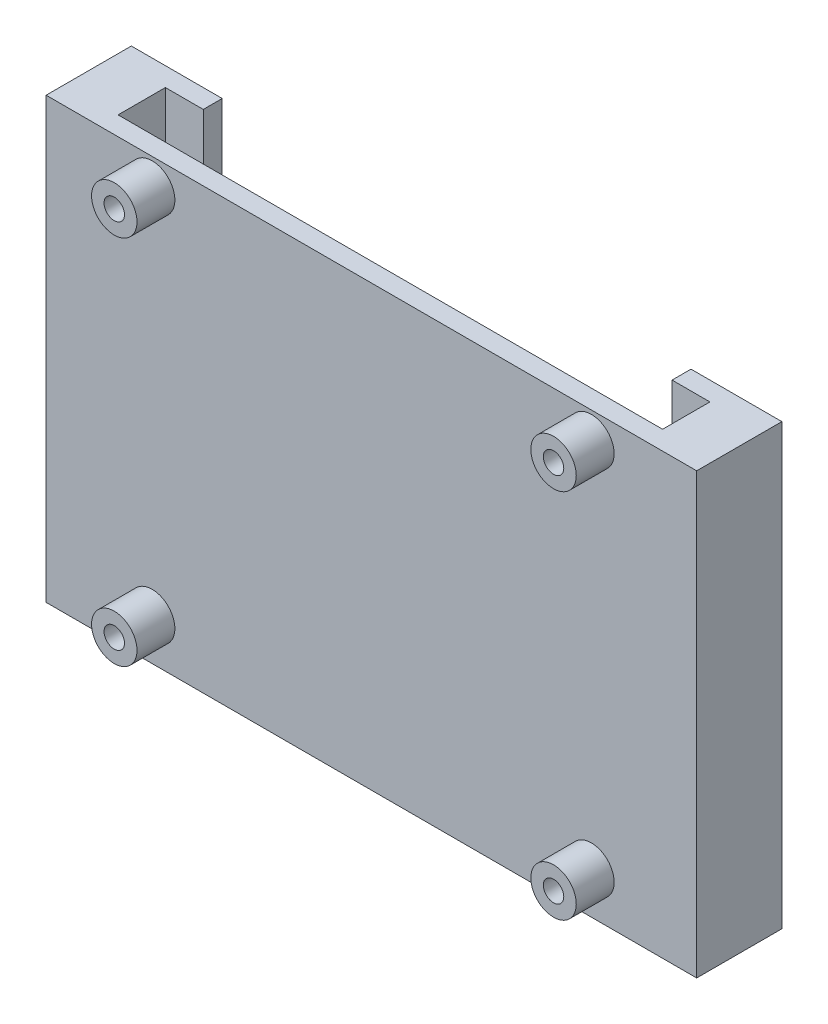
ISO-10303-21;
HEADER;
FILE_DESCRIPTION(('STEP AP214'),'2;1');
FILE_NAME('part.step','',(''),(''),'','','');
FILE_SCHEMA(('AUTOMOTIVE_DESIGN { 1 0 10303 214 1 1 1 1 }'));
ENDSEC;
DATA;
#1=APPLICATION_CONTEXT('core data for automotive mechanical design processes');
#2=APPLICATION_PROTOCOL_DEFINITION('international standard','automotive_design',2000,#1);
#3=PRODUCT_CONTEXT('',#1,'mechanical');
#4=PRODUCT('Part','Part','',(#3));
#5=PRODUCT_RELATED_PRODUCT_CATEGORY('part','',(#4));
#6=PRODUCT_DEFINITION_FORMATION('','',#4);
#7=PRODUCT_DEFINITION_CONTEXT('part definition',#1,'design');
#8=PRODUCT_DEFINITION('design','',#6,#7);
#9=PRODUCT_DEFINITION_SHAPE('','',#8);
#10=(LENGTH_UNIT() NAMED_UNIT(*) SI_UNIT(.MILLI.,.METRE.));
#11=(NAMED_UNIT(*) PLANE_ANGLE_UNIT() SI_UNIT($,.RADIAN.));
#12=(NAMED_UNIT(*) SI_UNIT($,.STERADIAN.) SOLID_ANGLE_UNIT());
#13=UNCERTAINTY_MEASURE_WITH_UNIT(LENGTH_MEASURE(1.E-05),#10,'distance_accuracy_value','');
#14=(GEOMETRIC_REPRESENTATION_CONTEXT(3) GLOBAL_UNCERTAINTY_ASSIGNED_CONTEXT((#13)) GLOBAL_UNIT_ASSIGNED_CONTEXT((#10,
#11,#12)) REPRESENTATION_CONTEXT('',''));
#15=CARTESIAN_POINT('',(0.,0.,0.));
#16=DIRECTION('',(0.,0.,1.));
#17=DIRECTION('',(1.,0.,0.));
#18=AXIS2_PLACEMENT_3D('',#15,#16,#17);
#19=CARTESIAN_POINT('',(-35.95,29.,-8.75));
#20=DIRECTION('',(-1.,0.,0.));
#21=DIRECTION('',(0.,-1.,0.));
#22=AXIS2_PLACEMENT_3D('',#19,#20,#21);
#23=PLANE('',#22);
#24=DIRECTION('',(0.,-1.,0.));
#25=VECTOR('',#24,1.);
#26=CARTESIAN_POINT('',(-35.95,29.,-6.24999999999999));
#27=LINE('',#26,#25);
#28=CARTESIAN_POINT('',(-35.95,29.,-6.24999999999999));
#29=VERTEX_POINT('',#28);
#30=CARTESIAN_POINT('',(-35.95,-29.,-6.24999999999999));
#31=VERTEX_POINT('',#30);
#32=EDGE_CURVE('E167',#29,#31,#27,.T.);
#33=ORIENTED_EDGE('',*,*,#32,.F.);
#34=DIRECTION('',(0.,0.,1.));
#35=VECTOR('',#34,1.);
#36=CARTESIAN_POINT('',(-35.95,29.,-8.75));
#37=LINE('',#36,#35);
#38=CARTESIAN_POINT('',(-35.95,29.,0.));
#39=VERTEX_POINT('',#38);
#40=EDGE_CURVE('E209',#29,#39,#37,.T.);
#41=ORIENTED_EDGE('',*,*,#40,.T.);
#42=DIRECTION('',(0.,-1.,0.));
#43=VECTOR('',#42,1.);
#44=CARTESIAN_POINT('',(-35.95,29.,0.));
#45=LINE('',#44,#43);
#46=CARTESIAN_POINT('',(-35.95,-29.,0.));
#47=VERTEX_POINT('',#46);
#48=EDGE_CURVE('E214',#39,#47,#45,.T.);
#49=ORIENTED_EDGE('',*,*,#48,.T.);
#50=DIRECTION('',(0.,0.,1.));
#51=VECTOR('',#50,1.);
#52=CARTESIAN_POINT('',(-35.95,-29.,-8.75));
#53=LINE('',#52,#51);
#54=EDGE_CURVE('E61',#31,#47,#53,.T.);
#55=ORIENTED_EDGE('',*,*,#54,.F.);
#56=EDGE_LOOP('',(#33,#41,#49,#55));
#57=FACE_BOUND('',#56,.T.);
#58=ADVANCED_FACE('F45',(#57),#23,.F.);
#59=CARTESIAN_POINT('',(35.95,29.,-8.75));
#60=DIRECTION('',(1.,0.,0.));
#61=DIRECTION('',(0.,1.,0.));
#62=AXIS2_PLACEMENT_3D('',#59,#60,#61);
#63=PLANE('',#62);
#64=DIRECTION('',(0.,1.,0.));
#65=VECTOR('',#64,1.);
#66=CARTESIAN_POINT('',(35.95,29.,-6.25));
#67=LINE('',#66,#65);
#68=CARTESIAN_POINT('',(35.95,-29.,-6.24999999999999));
#69=VERTEX_POINT('',#68);
#70=CARTESIAN_POINT('',(35.95,29.,-6.25));
#71=VERTEX_POINT('',#70);
#72=EDGE_CURVE('E185',#69,#71,#67,.T.);
#73=ORIENTED_EDGE('',*,*,#72,.F.);
#74=DIRECTION('',(0.,0.,1.));
#75=VECTOR('',#74,1.);
#76=CARTESIAN_POINT('',(35.95,-29.,-8.75));
#77=LINE('',#76,#75);
#78=CARTESIAN_POINT('',(35.95,-29.,0.));
#79=VERTEX_POINT('',#78);
#80=EDGE_CURVE('E69',#69,#79,#77,.T.);
#81=ORIENTED_EDGE('',*,*,#80,.T.);
#82=DIRECTION('',(0.,1.,0.));
#83=VECTOR('',#82,1.);
#84=CARTESIAN_POINT('',(35.95,29.,0.));
#85=LINE('',#84,#83);
#86=CARTESIAN_POINT('',(35.95,29.,0.));
#87=VERTEX_POINT('',#86);
#88=EDGE_CURVE('E217',#79,#87,#85,.T.);
#89=ORIENTED_EDGE('',*,*,#88,.T.);
#90=DIRECTION('',(0.,0.,1.));
#91=VECTOR('',#90,1.);
#92=CARTESIAN_POINT('',(35.95,29.,-8.75));
#93=LINE('',#92,#91);
#94=EDGE_CURVE('E233',#71,#87,#93,.T.);
#95=ORIENTED_EDGE('',*,*,#94,.F.);
#96=EDGE_LOOP('',(#73,#81,#89,#95));
#97=FACE_BOUND('',#96,.T.);
#98=ADVANCED_FACE('F364',(#97),#63,.F.);
#99=CARTESIAN_POINT('',(0.,0.,0.));
#100=DIRECTION('',(0.,0.,-1.));
#101=DIRECTION('',(-1.,0.,0.));
#102=AXIS2_PLACEMENT_3D('',#99,#100,#101);
#103=PLANE('',#102);
#104=CARTESIAN_POINT('',(-28.95,25.5,0.));
#105=DIRECTION('',(0.,0.,1.));
#106=DIRECTION('',(1.,0.,0.));
#107=AXIS2_PLACEMENT_3D('',#104,#105,#106);
#108=CIRCLE('',#107,1.35);
#109=CARTESIAN_POINT('',(-27.6,25.5,0.));
#110=VERTEX_POINT('',#109);
#111=EDGE_CURVE('E244',#110,#110,#108,.T.);
#112=ORIENTED_EDGE('',*,*,#111,.T.);
#113=EDGE_LOOP('',(#112));
#114=FACE_BOUND('',#113,.T.);
#115=CARTESIAN_POINT('',(-28.95,-23.5,0.));
#116=DIRECTION('',(0.,0.,1.));
#117=DIRECTION('',(1.,0.,0.));
#118=AXIS2_PLACEMENT_3D('',#115,#116,#117);
#119=CIRCLE('',#118,1.35);
#120=CARTESIAN_POINT('',(-27.6,-23.5,0.));
#121=VERTEX_POINT('',#120);
#122=EDGE_CURVE('E252',#121,#121,#119,.T.);
#123=ORIENTED_EDGE('',*,*,#122,.T.);
#124=EDGE_LOOP('',(#123));
#125=FACE_BOUND('',#124,.T.);
#126=CARTESIAN_POINT('',(29.05,25.5,0.));
#127=DIRECTION('',(0.,0.,1.));
#128=DIRECTION('',(1.,0.,0.));
#129=AXIS2_PLACEMENT_3D('',#126,#127,#128);
#130=CIRCLE('',#129,1.35);
#131=CARTESIAN_POINT('',(30.4,25.5,0.));
#132=VERTEX_POINT('',#131);
#133=EDGE_CURVE('E260',#132,#132,#130,.T.);
#134=ORIENTED_EDGE('',*,*,#133,.T.);
#135=EDGE_LOOP('',(#134));
#136=FACE_BOUND('',#135,.T.);
#137=CARTESIAN_POINT('',(29.05,-23.5,0.));
#138=DIRECTION('',(0.,0.,1.));
#139=DIRECTION('',(1.,0.,0.));
#140=AXIS2_PLACEMENT_3D('',#137,#138,#139);
#141=CIRCLE('',#140,1.35);
#142=CARTESIAN_POINT('',(30.4,-23.5,0.));
#143=VERTEX_POINT('',#142);
#144=EDGE_CURVE('E268',#143,#143,#141,.T.);
#145=ORIENTED_EDGE('',*,*,#144,.T.);
#146=EDGE_LOOP('',(#145));
#147=FACE_BOUND('',#146,.T.);
#148=DIRECTION('',(1.,0.,0.));
#149=VECTOR('',#148,1.);
#150=CARTESIAN_POINT('',(-42.95,-29.,0.));
#151=LINE('',#150,#149);
#152=EDGE_CURVE('E294',#47,#79,#151,.T.);
#153=ORIENTED_EDGE('',*,*,#152,.F.);
#154=ORIENTED_EDGE('',*,*,#48,.F.);
#155=DIRECTION('',(-1.,0.,0.));
#156=VECTOR('',#155,1.);
#157=CARTESIAN_POINT('',(-42.95,29.,0.));
#158=LINE('',#157,#156);
#159=EDGE_CURVE('E288',#87,#39,#158,.T.);
#160=ORIENTED_EDGE('',*,*,#159,.F.);
#161=ORIENTED_EDGE('',*,*,#88,.F.);
#162=EDGE_LOOP('',(#153,#154,#160,#161));
#163=FACE_BOUND('',#162,.T.);
#164=ADVANCED_FACE('F368',(#114,#125,#136,#147,#163),#103,.T.);
#165=CARTESIAN_POINT('',(42.95,-29.,2.5));
#166=DIRECTION('',(-1.,0.,0.));
#167=DIRECTION('',(0.,0.,1.));
#168=AXIS2_PLACEMENT_3D('',#165,#166,#167);
#169=PLANE('',#168);
#170=DIRECTION('',(0.,0.,-1.));
#171=VECTOR('',#170,1.);
#172=CARTESIAN_POINT('',(42.95,-29.,2.5));
#173=LINE('',#172,#171);
#174=CARTESIAN_POINT('',(42.95,-29.,2.5));
#175=VERTEX_POINT('',#174);
#176=CARTESIAN_POINT('',(42.95,-29.,-8.75));
#177=VERTEX_POINT('',#176);
#178=EDGE_CURVE('E303',#175,#177,#173,.T.);
#179=ORIENTED_EDGE('',*,*,#178,.T.);
#180=DIRECTION('',(0.,-1.,0.));
#181=VECTOR('',#180,1.);
#182=CARTESIAN_POINT('',(42.95,29.,-8.75));
#183=LINE('',#182,#181);
#184=CARTESIAN_POINT('',(42.95,29.,-8.75));
#185=VERTEX_POINT('',#184);
#186=EDGE_CURVE('E222',#185,#177,#183,.T.);
#187=ORIENTED_EDGE('',*,*,#186,.F.);
#188=DIRECTION('',(0.,0.,-1.));
#189=VECTOR('',#188,1.);
#190=CARTESIAN_POINT('',(42.95,29.,2.5));
#191=LINE('',#190,#189);
#192=CARTESIAN_POINT('',(42.95,29.,2.5));
#193=VERTEX_POINT('',#192);
#194=EDGE_CURVE('E317',#193,#185,#191,.T.);
#195=ORIENTED_EDGE('',*,*,#194,.F.);
#196=DIRECTION('',(0.,1.,0.));
#197=VECTOR('',#196,1.);
#198=CARTESIAN_POINT('',(42.95,-29.,2.5));
#199=LINE('',#198,#197);
#200=EDGE_CURVE('E289',#175,#193,#199,.T.);
#201=ORIENTED_EDGE('',*,*,#200,.F.);
#202=EDGE_LOOP('',(#179,#187,#195,#201));
#203=FACE_BOUND('',#202,.T.);
#204=ADVANCED_FACE('F47',(#203),#169,.F.);
#205=CARTESIAN_POINT('',(-42.95,29.,2.5));
#206=DIRECTION('',(0.,-1.,0.));
#207=DIRECTION('',(0.,0.,-1.));
#208=AXIS2_PLACEMENT_3D('',#205,#206,#207);
#209=PLANE('',#208);
#210=ORIENTED_EDGE('',*,*,#194,.T.);
#211=DIRECTION('',(1.,0.,0.));
#212=VECTOR('',#211,1.);
#213=CARTESIAN_POINT('',(42.95,29.,-8.75));
#214=LINE('',#213,#212);
#215=CARTESIAN_POINT('',(30.95,29.,-8.75));
#216=VERTEX_POINT('',#215);
#217=EDGE_CURVE('E229',#216,#185,#214,.T.);
#218=ORIENTED_EDGE('',*,*,#217,.F.);
#219=DIRECTION('',(0.,0.,-1.));
#220=VECTOR('',#219,1.);
#221=CARTESIAN_POINT('',(30.95,29.,-8.75));
#222=LINE('',#221,#220);
#223=CARTESIAN_POINT('',(30.95,29.,-6.25));
#224=VERTEX_POINT('',#223);
#225=EDGE_CURVE('E196',#224,#216,#222,.T.);
#226=ORIENTED_EDGE('',*,*,#225,.F.);
#227=DIRECTION('',(1.,0.,0.));
#228=VECTOR('',#227,1.);
#229=CARTESIAN_POINT('',(30.95,29.,-6.25));
#230=LINE('',#229,#228);
#231=EDGE_CURVE('E200',#224,#71,#230,.T.);
#232=ORIENTED_EDGE('',*,*,#231,.T.);
#233=ORIENTED_EDGE('',*,*,#94,.T.);
#234=ORIENTED_EDGE('',*,*,#159,.T.);
#235=ORIENTED_EDGE('',*,*,#40,.F.);
#236=DIRECTION('',(-1.,0.,0.));
#237=VECTOR('',#236,1.);
#238=CARTESIAN_POINT('',(-30.95,29.,-6.24999999999999));
#239=LINE('',#238,#237);
#240=CARTESIAN_POINT('',(-30.95,29.,-6.24999999999999));
#241=VERTEX_POINT('',#240);
#242=EDGE_CURVE('E156',#241,#29,#239,.T.);
#243=ORIENTED_EDGE('',*,*,#242,.F.);
#244=DIRECTION('',(0.,0.,1.));
#245=VECTOR('',#244,1.);
#246=CARTESIAN_POINT('',(-30.95,29.,-8.75));
#247=LINE('',#246,#245);
#248=CARTESIAN_POINT('',(-30.95,29.,-8.75));
#249=VERTEX_POINT('',#248);
#250=EDGE_CURVE('E153',#249,#241,#247,.T.);
#251=ORIENTED_EDGE('',*,*,#250,.F.);
#252=DIRECTION('',(1.,0.,0.));
#253=VECTOR('',#252,1.);
#254=CARTESIAN_POINT('',(-42.95,29.,-8.75));
#255=LINE('',#254,#253);
#256=CARTESIAN_POINT('',(-42.95,29.,-8.75));
#257=VERTEX_POINT('',#256);
#258=EDGE_CURVE('E139',#257,#249,#255,.T.);
#259=ORIENTED_EDGE('',*,*,#258,.F.);
#260=DIRECTION('',(0.,0.,-1.));
#261=VECTOR('',#260,1.);
#262=CARTESIAN_POINT('',(-42.95,29.,2.5));
#263=LINE('',#262,#261);
#264=CARTESIAN_POINT('',(-42.95,29.,2.5));
#265=VERTEX_POINT('',#264);
#266=EDGE_CURVE('E314',#265,#257,#263,.T.);
#267=ORIENTED_EDGE('',*,*,#266,.F.);
#268=DIRECTION('',(-1.,0.,0.));
#269=VECTOR('',#268,1.);
#270=CARTESIAN_POINT('',(-42.95,29.,2.5));
#271=LINE('',#270,#269);
#272=EDGE_CURVE('E293',#193,#265,#271,.T.);
#273=ORIENTED_EDGE('',*,*,#272,.F.);
#274=EDGE_LOOP('',(#210,#218,#226,#232,#233,#234,#235,#243,#251,#259,#267,#273));
#275=FACE_BOUND('',#274,.T.);
#276=ADVANCED_FACE('F154',(#275),#209,.F.);
#277=CARTESIAN_POINT('',(-42.95,-29.,2.5));
#278=DIRECTION('',(1.,0.,0.));
#279=DIRECTION('',(0.,0.,-1.));
#280=AXIS2_PLACEMENT_3D('',#277,#278,#279);
#281=PLANE('',#280);
#282=ORIENTED_EDGE('',*,*,#266,.T.);
#283=DIRECTION('',(0.,1.,0.));
#284=VECTOR('',#283,1.);
#285=CARTESIAN_POINT('',(-42.95,29.,-8.75));
#286=LINE('',#285,#284);
#287=CARTESIAN_POINT('',(-42.95,-29.,-8.75));
#288=VERTEX_POINT('',#287);
#289=EDGE_CURVE('E146',#288,#257,#286,.T.);
#290=ORIENTED_EDGE('',*,*,#289,.F.);
#291=DIRECTION('',(0.,0.,-1.));
#292=VECTOR('',#291,1.);
#293=CARTESIAN_POINT('',(-42.95,-29.,2.5));
#294=LINE('',#293,#292);
#295=CARTESIAN_POINT('',(-42.95,-29.,2.5));
#296=VERTEX_POINT('',#295);
#297=EDGE_CURVE('E311',#296,#288,#294,.T.);
#298=ORIENTED_EDGE('',*,*,#297,.F.);
#299=DIRECTION('',(0.,-1.,0.));
#300=VECTOR('',#299,1.);
#301=CARTESIAN_POINT('',(-42.95,-29.,2.5));
#302=LINE('',#301,#300);
#303=EDGE_CURVE('E297',#265,#296,#302,.T.);
#304=ORIENTED_EDGE('',*,*,#303,.F.);
#305=EDGE_LOOP('',(#282,#290,#298,#304));
#306=FACE_BOUND('',#305,.T.);
#307=ADVANCED_FACE('F377',(#306),#281,.F.);
#308=CARTESIAN_POINT('',(-42.95,-29.,2.5));
#309=DIRECTION('',(0.,1.,0.));
#310=DIRECTION('',(0.,0.,1.));
#311=AXIS2_PLACEMENT_3D('',#308,#309,#310);
#312=PLANE('',#311);
#313=CARTESIAN_POINT('',(-39.45,-29.,-3.125));
#314=DIRECTION('',(0.,-1.,0.));
#315=DIRECTION('',(0.,0.,-1.));
#316=AXIS2_PLACEMENT_3D('',#313,#314,#315);
#317=CIRCLE('',#316,3.15);
#318=CARTESIAN_POINT('',(-39.45,-29.,-6.275));
#319=VERTEX_POINT('',#318);
#320=EDGE_CURVE('E576',#319,#319,#317,.T.);
#321=ORIENTED_EDGE('',*,*,#320,.F.);
#322=EDGE_LOOP('',(#321));
#323=FACE_BOUND('',#322,.T.);
#324=CARTESIAN_POINT('',(39.45,-29.,-3.125));
#325=DIRECTION('',(0.,-1.,0.));
#326=DIRECTION('',(0.,0.,-1.));
#327=AXIS2_PLACEMENT_3D('',#324,#325,#326);
#328=CIRCLE('',#327,3.15);
#329=CARTESIAN_POINT('',(39.45,-29.,-6.275));
#330=VERTEX_POINT('',#329);
#331=EDGE_CURVE('E580',#330,#330,#328,.T.);
#332=ORIENTED_EDGE('',*,*,#331,.F.);
#333=EDGE_LOOP('',(#332));
#334=FACE_BOUND('',#333,.T.);
#335=ORIENTED_EDGE('',*,*,#297,.T.);
#336=DIRECTION('',(-1.,0.,0.));
#337=VECTOR('',#336,1.);
#338=CARTESIAN_POINT('',(-42.95,-29.,-8.75));
#339=LINE('',#338,#337);
#340=CARTESIAN_POINT('',(-30.95,-29.,-8.75000000000001));
#341=VERTEX_POINT('',#340);
#342=EDGE_CURVE('E150',#341,#288,#339,.T.);
#343=ORIENTED_EDGE('',*,*,#342,.F.);
#344=DIRECTION('',(0.,0.,-1.));
#345=VECTOR('',#344,1.);
#346=CARTESIAN_POINT('',(-30.95,-29.,-8.75000000000001));
#347=LINE('',#346,#345);
#348=CARTESIAN_POINT('',(-30.95,-29.,-6.24999999999999));
#349=VERTEX_POINT('',#348);
#350=EDGE_CURVE('E165',#349,#341,#347,.T.);
#351=ORIENTED_EDGE('',*,*,#350,.F.);
#352=DIRECTION('',(-1.,0.,0.));
#353=VECTOR('',#352,1.);
#354=CARTESIAN_POINT('',(-30.95,-29.,-6.24999999999999));
#355=LINE('',#354,#353);
#356=EDGE_CURVE('E179',#349,#31,#355,.T.);
#357=ORIENTED_EDGE('',*,*,#356,.T.);
#358=ORIENTED_EDGE('',*,*,#54,.T.);
#359=ORIENTED_EDGE('',*,*,#152,.T.);
#360=ORIENTED_EDGE('',*,*,#80,.F.);
#361=DIRECTION('',(1.,0.,0.));
#362=VECTOR('',#361,1.);
#363=CARTESIAN_POINT('',(30.95,-29.,-6.24999999999999));
#364=LINE('',#363,#362);
#365=CARTESIAN_POINT('',(30.95,-29.,-6.24999999999999));
#366=VERTEX_POINT('',#365);
#367=EDGE_CURVE('E206',#366,#69,#364,.T.);
#368=ORIENTED_EDGE('',*,*,#367,.F.);
#369=DIRECTION('',(0.,0.,1.));
#370=VECTOR('',#369,1.);
#371=CARTESIAN_POINT('',(30.95,-29.,-8.74999999999999));
#372=LINE('',#371,#370);
#373=CARTESIAN_POINT('',(30.95,-29.,-8.74999999999999));
#374=VERTEX_POINT('',#373);
#375=EDGE_CURVE('E190',#374,#366,#372,.T.);
#376=ORIENTED_EDGE('',*,*,#375,.F.);
#377=DIRECTION('',(-1.,0.,0.));
#378=VECTOR('',#377,1.);
#379=CARTESIAN_POINT('',(42.95,-29.,-8.75));
#380=LINE('',#379,#378);
#381=EDGE_CURVE('E226',#177,#374,#380,.T.);
#382=ORIENTED_EDGE('',*,*,#381,.F.);
#383=ORIENTED_EDGE('',*,*,#178,.F.);
#384=DIRECTION('',(1.,0.,0.));
#385=VECTOR('',#384,1.);
#386=CARTESIAN_POINT('',(-42.95,-29.,2.5));
#387=LINE('',#386,#385);
#388=EDGE_CURVE('E300',#296,#175,#387,.T.);
#389=ORIENTED_EDGE('',*,*,#388,.F.);
#390=EDGE_LOOP('',(#335,#343,#351,#357,#358,#359,#360,#368,#376,#382,#383,#389));
#391=FACE_BOUND('',#390,.T.);
#392=ADVANCED_FACE('F337',(#323,#334,#391),#312,.F.);
#393=CARTESIAN_POINT('',(0.,0.,2.5));
#394=DIRECTION('',(0.,0.,-1.));
#395=DIRECTION('',(-1.,0.,0.));
#396=AXIS2_PLACEMENT_3D('',#393,#394,#395);
#397=PLANE('',#396);
#398=CARTESIAN_POINT('',(29.05,-23.5,2.5));
#399=DIRECTION('',(0.,0.,-1.));
#400=DIRECTION('',(-1.,0.,0.));
#401=AXIS2_PLACEMENT_3D('',#398,#399,#400);
#402=CIRCLE('',#401,3.);
#403=CARTESIAN_POINT('',(26.05,-23.5,2.5));
#404=VERTEX_POINT('',#403);
#405=EDGE_CURVE('E11',#404,#404,#402,.F.);
#406=ORIENTED_EDGE('',*,*,#405,.F.);
#407=EDGE_LOOP('',(#406));
#408=FACE_BOUND('',#407,.T.);
#409=CARTESIAN_POINT('',(-28.95,-23.5,2.5));
#410=DIRECTION('',(0.,0.,-1.));
#411=DIRECTION('',(-1.,0.,0.));
#412=AXIS2_PLACEMENT_3D('',#409,#410,#411);
#413=CIRCLE('',#412,3.);
#414=CARTESIAN_POINT('',(-31.95,-23.5,2.5));
#415=VERTEX_POINT('',#414);
#416=EDGE_CURVE('E54',#415,#415,#413,.F.);
#417=ORIENTED_EDGE('',*,*,#416,.F.);
#418=EDGE_LOOP('',(#417));
#419=FACE_BOUND('',#418,.T.);
#420=CARTESIAN_POINT('',(29.05,25.5,2.5));
#421=DIRECTION('',(0.,0.,-1.));
#422=DIRECTION('',(-1.,0.,0.));
#423=AXIS2_PLACEMENT_3D('',#420,#421,#422);
#424=CIRCLE('',#423,3.);
#425=CARTESIAN_POINT('',(26.05,25.5,2.5));
#426=VERTEX_POINT('',#425);
#427=EDGE_CURVE('E324',#426,#426,#424,.F.);
#428=ORIENTED_EDGE('',*,*,#427,.F.);
#429=EDGE_LOOP('',(#428));
#430=FACE_BOUND('',#429,.T.);
#431=CARTESIAN_POINT('',(-28.95,25.5,2.5));
#432=DIRECTION('',(0.,0.,-1.));
#433=DIRECTION('',(-1.,0.,0.));
#434=AXIS2_PLACEMENT_3D('',#431,#432,#433);
#435=CIRCLE('',#434,3.);
#436=CARTESIAN_POINT('',(-31.95,25.5,2.5));
#437=VERTEX_POINT('',#436);
#438=EDGE_CURVE('E320',#437,#437,#435,.F.);
#439=ORIENTED_EDGE('',*,*,#438,.F.);
#440=EDGE_LOOP('',(#439));
#441=FACE_BOUND('',#440,.T.);
#442=ORIENTED_EDGE('',*,*,#200,.T.);
#443=ORIENTED_EDGE('',*,*,#272,.T.);
#444=ORIENTED_EDGE('',*,*,#303,.T.);
#445=ORIENTED_EDGE('',*,*,#388,.T.);
#446=EDGE_LOOP('',(#442,#443,#444,#445));
#447=FACE_BOUND('',#446,.T.);
#448=ADVANCED_FACE('F333',(#408,#419,#430,#441,#447),#397,.F.);
#449=CARTESIAN_POINT('',(-28.95,25.5,7.5));
#450=DIRECTION('',(0.,0.,-1.));
#451=DIRECTION('',(-1.,0.,0.));
#452=AXIS2_PLACEMENT_3D('',#449,#450,#451);
#453=CYLINDRICAL_SURFACE('',#452,3.);
#454=CARTESIAN_POINT('',(-28.95,25.5,7.5));
#455=DIRECTION('',(0.,0.,1.));
#456=DIRECTION('',(1.,0.,0.));
#457=AXIS2_PLACEMENT_3D('',#454,#455,#456);
#458=CIRCLE('',#457,3.);
#459=CARTESIAN_POINT('',(-25.95,25.5,7.5));
#460=VERTEX_POINT('',#459);
#461=EDGE_CURVE('E284',#460,#460,#458,.T.);
#462=ORIENTED_EDGE('',*,*,#461,.F.);
#463=EDGE_LOOP('',(#462));
#464=FACE_BOUND('',#463,.T.);
#465=ORIENTED_EDGE('',*,*,#438,.T.);
#466=EDGE_LOOP('',(#465));
#467=FACE_BOUND('',#466,.T.);
#468=ADVANCED_FACE('F336',(#464,#467),#453,.T.);
#469=CARTESIAN_POINT('',(-28.95,25.5,7.5));
#470=DIRECTION('',(0.,0.,1.));
#471=DIRECTION('',(1.,0.,0.));
#472=AXIS2_PLACEMENT_3D('',#469,#470,#471);
#473=PLANE('',#472);
#474=CARTESIAN_POINT('',(-28.95,25.5,7.5));
#475=DIRECTION('',(0.,0.,1.));
#476=DIRECTION('',(1.,0.,0.));
#477=AXIS2_PLACEMENT_3D('',#474,#475,#476);
#478=CIRCLE('',#477,1.34999999999999);
#479=CARTESIAN_POINT('',(-27.6,25.5,7.5));
#480=VERTEX_POINT('',#479);
#481=EDGE_CURVE('E240',#480,#480,#478,.T.);
#482=ORIENTED_EDGE('',*,*,#481,.F.);
#483=EDGE_LOOP('',(#482));
#484=FACE_BOUND('',#483,.T.);
#485=ORIENTED_EDGE('',*,*,#461,.T.);
#486=EDGE_LOOP('',(#485));
#487=FACE_BOUND('',#486,.T.);
#488=ADVANCED_FACE('F433',(#484,#487),#473,.T.);
#489=CARTESIAN_POINT('',(29.05,25.5,7.5));
#490=DIRECTION('',(0.,0.,-1.));
#491=DIRECTION('',(-1.,0.,0.));
#492=AXIS2_PLACEMENT_3D('',#489,#490,#491);
#493=CYLINDRICAL_SURFACE('',#492,3.);
#494=CARTESIAN_POINT('',(29.05,25.5,7.5));
#495=DIRECTION('',(0.,0.,1.));
#496=DIRECTION('',(1.,0.,0.));
#497=AXIS2_PLACEMENT_3D('',#494,#495,#496);
#498=CIRCLE('',#497,3.);
#499=CARTESIAN_POINT('',(32.05,25.5,7.5));
#500=VERTEX_POINT('',#499);
#501=EDGE_CURVE('E280',#500,#500,#498,.T.);
#502=ORIENTED_EDGE('',*,*,#501,.F.);
#503=EDGE_LOOP('',(#502));
#504=FACE_BOUND('',#503,.T.);
#505=ORIENTED_EDGE('',*,*,#427,.T.);
#506=EDGE_LOOP('',(#505));
#507=FACE_BOUND('',#506,.T.);
#508=ADVANCED_FACE('F430',(#504,#507),#493,.T.);
#509=CARTESIAN_POINT('',(29.05,25.5,7.5));
#510=DIRECTION('',(0.,0.,1.));
#511=DIRECTION('',(1.,0.,0.));
#512=AXIS2_PLACEMENT_3D('',#509,#510,#511);
#513=PLANE('',#512);
#514=CARTESIAN_POINT('',(29.05,25.5,7.5));
#515=DIRECTION('',(0.,0.,1.));
#516=DIRECTION('',(1.,0.,0.));
#517=AXIS2_PLACEMENT_3D('',#514,#515,#516);
#518=CIRCLE('',#517,1.34999999999999);
#519=CARTESIAN_POINT('',(30.4,25.5,7.5));
#520=VERTEX_POINT('',#519);
#521=EDGE_CURVE('E256',#520,#520,#518,.T.);
#522=ORIENTED_EDGE('',*,*,#521,.F.);
#523=EDGE_LOOP('',(#522));
#524=FACE_BOUND('',#523,.T.);
#525=ORIENTED_EDGE('',*,*,#501,.T.);
#526=EDGE_LOOP('',(#525));
#527=FACE_BOUND('',#526,.T.);
#528=ADVANCED_FACE('F428',(#524,#527),#513,.T.);
#529=CARTESIAN_POINT('',(-28.95,-23.5,7.5));
#530=DIRECTION('',(0.,0.,-1.));
#531=DIRECTION('',(-1.,0.,0.));
#532=AXIS2_PLACEMENT_3D('',#529,#530,#531);
#533=CYLINDRICAL_SURFACE('',#532,3.);
#534=CARTESIAN_POINT('',(-28.95,-23.5,7.5));
#535=DIRECTION('',(0.,0.,1.));
#536=DIRECTION('',(1.,0.,0.));
#537=AXIS2_PLACEMENT_3D('',#534,#535,#536);
#538=CIRCLE('',#537,3.);
#539=CARTESIAN_POINT('',(-25.95,-23.5,7.5));
#540=VERTEX_POINT('',#539);
#541=EDGE_CURVE('E276',#540,#540,#538,.T.);
#542=ORIENTED_EDGE('',*,*,#541,.F.);
#543=EDGE_LOOP('',(#542));
#544=FACE_BOUND('',#543,.T.);
#545=ORIENTED_EDGE('',*,*,#416,.T.);
#546=EDGE_LOOP('',(#545));
#547=FACE_BOUND('',#546,.T.);
#548=ADVANCED_FACE('F331',(#544,#547),#533,.T.);
#549=CARTESIAN_POINT('',(-28.95,-23.5,7.5));
#550=DIRECTION('',(0.,0.,1.));
#551=DIRECTION('',(1.,0.,0.));
#552=AXIS2_PLACEMENT_3D('',#549,#550,#551);
#553=PLANE('',#552);
#554=CARTESIAN_POINT('',(-28.95,-23.5,7.5));
#555=DIRECTION('',(0.,0.,1.));
#556=DIRECTION('',(1.,0.,0.));
#557=AXIS2_PLACEMENT_3D('',#554,#555,#556);
#558=CIRCLE('',#557,1.34999999999999);
#559=CARTESIAN_POINT('',(-27.6,-23.5,7.5));
#560=VERTEX_POINT('',#559);
#561=EDGE_CURVE('E248',#560,#560,#558,.T.);
#562=ORIENTED_EDGE('',*,*,#561,.F.);
#563=EDGE_LOOP('',(#562));
#564=FACE_BOUND('',#563,.T.);
#565=ORIENTED_EDGE('',*,*,#541,.T.);
#566=EDGE_LOOP('',(#565));
#567=FACE_BOUND('',#566,.T.);
#568=ADVANCED_FACE('F421',(#564,#567),#553,.T.);
#569=CARTESIAN_POINT('',(29.05,-23.5,7.5));
#570=DIRECTION('',(0.,0.,-1.));
#571=DIRECTION('',(-1.,0.,0.));
#572=AXIS2_PLACEMENT_3D('',#569,#570,#571);
#573=CYLINDRICAL_SURFACE('',#572,3.);
#574=CARTESIAN_POINT('',(29.05,-23.5,7.5));
#575=DIRECTION('',(0.,0.,1.));
#576=DIRECTION('',(1.,0.,0.));
#577=AXIS2_PLACEMENT_3D('',#574,#575,#576);
#578=CIRCLE('',#577,3.);
#579=CARTESIAN_POINT('',(32.05,-23.5,7.5));
#580=VERTEX_POINT('',#579);
#581=EDGE_CURVE('E272',#580,#580,#578,.T.);
#582=ORIENTED_EDGE('',*,*,#581,.F.);
#583=EDGE_LOOP('',(#582));
#584=FACE_BOUND('',#583,.T.);
#585=ORIENTED_EDGE('',*,*,#405,.T.);
#586=EDGE_LOOP('',(#585));
#587=FACE_BOUND('',#586,.T.);
#588=ADVANCED_FACE('F417',(#584,#587),#573,.T.);
#589=CARTESIAN_POINT('',(29.05,-23.5,7.5));
#590=DIRECTION('',(0.,0.,1.));
#591=DIRECTION('',(1.,0.,0.));
#592=AXIS2_PLACEMENT_3D('',#589,#590,#591);
#593=PLANE('',#592);
#594=CARTESIAN_POINT('',(29.05,-23.5,7.5));
#595=DIRECTION('',(0.,0.,1.));
#596=DIRECTION('',(1.,0.,0.));
#597=AXIS2_PLACEMENT_3D('',#594,#595,#596);
#598=CIRCLE('',#597,1.34999999999999);
#599=CARTESIAN_POINT('',(30.4,-23.5,7.5));
#600=VERTEX_POINT('',#599);
#601=EDGE_CURVE('E264',#600,#600,#598,.T.);
#602=ORIENTED_EDGE('',*,*,#601,.F.);
#603=EDGE_LOOP('',(#602));
#604=FACE_BOUND('',#603,.T.);
#605=ORIENTED_EDGE('',*,*,#581,.T.);
#606=EDGE_LOOP('',(#605));
#607=FACE_BOUND('',#606,.T.);
#608=ADVANCED_FACE('F413',(#604,#607),#593,.T.);
#609=CARTESIAN_POINT('',(29.05,-23.5,7.5));
#610=DIRECTION('',(0.,0.,1.));
#611=DIRECTION('',(1.,0.,0.));
#612=AXIS2_PLACEMENT_3D('',#609,#610,#611);
#613=CYLINDRICAL_SURFACE('',#612,1.35);
#614=ORIENTED_EDGE('',*,*,#144,.F.);
#615=EDGE_LOOP('',(#614));
#616=FACE_BOUND('',#615,.T.);
#617=ORIENTED_EDGE('',*,*,#601,.T.);
#618=EDGE_LOOP('',(#617));
#619=FACE_BOUND('',#618,.T.);
#620=ADVANCED_FACE('F409',(#616,#619),#613,.F.);
#621=CARTESIAN_POINT('',(29.05,25.5,7.5));
#622=DIRECTION('',(0.,0.,1.));
#623=DIRECTION('',(1.,0.,0.));
#624=AXIS2_PLACEMENT_3D('',#621,#622,#623);
#625=CYLINDRICAL_SURFACE('',#624,1.35);
#626=ORIENTED_EDGE('',*,*,#133,.F.);
#627=EDGE_LOOP('',(#626));
#628=FACE_BOUND('',#627,.T.);
#629=ORIENTED_EDGE('',*,*,#521,.T.);
#630=EDGE_LOOP('',(#629));
#631=FACE_BOUND('',#630,.T.);
#632=ADVANCED_FACE('F405',(#628,#631),#625,.F.);
#633=CARTESIAN_POINT('',(-28.95,-23.5,7.5));
#634=DIRECTION('',(0.,0.,1.));
#635=DIRECTION('',(1.,0.,0.));
#636=AXIS2_PLACEMENT_3D('',#633,#634,#635);
#637=CYLINDRICAL_SURFACE('',#636,1.35);
#638=ORIENTED_EDGE('',*,*,#122,.F.);
#639=EDGE_LOOP('',(#638));
#640=FACE_BOUND('',#639,.T.);
#641=ORIENTED_EDGE('',*,*,#561,.T.);
#642=EDGE_LOOP('',(#641));
#643=FACE_BOUND('',#642,.T.);
#644=ADVANCED_FACE('F401',(#640,#643),#637,.F.);
#645=CARTESIAN_POINT('',(-28.95,25.5,7.5));
#646=DIRECTION('',(0.,0.,1.));
#647=DIRECTION('',(1.,0.,0.));
#648=AXIS2_PLACEMENT_3D('',#645,#646,#647);
#649=CYLINDRICAL_SURFACE('',#648,1.35);
#650=ORIENTED_EDGE('',*,*,#111,.F.);
#651=EDGE_LOOP('',(#650));
#652=FACE_BOUND('',#651,.T.);
#653=ORIENTED_EDGE('',*,*,#481,.T.);
#654=EDGE_LOOP('',(#653));
#655=FACE_BOUND('',#654,.T.);
#656=ADVANCED_FACE('F397',(#652,#655),#649,.F.);
#657=CARTESIAN_POINT('',(0.,0.,-8.75));
#658=DIRECTION('',(0.,0.,-1.));
#659=DIRECTION('',(-1.,0.,0.));
#660=AXIS2_PLACEMENT_3D('',#657,#658,#659);
#661=PLANE('',#660);
#662=ORIENTED_EDGE('',*,*,#186,.T.);
#663=ORIENTED_EDGE('',*,*,#381,.T.);
#664=DIRECTION('',(0.,-1.,0.));
#665=VECTOR('',#664,1.);
#666=CARTESIAN_POINT('',(30.95,29.,-8.75));
#667=LINE('',#666,#665);
#668=EDGE_CURVE('E186',#216,#374,#667,.T.);
#669=ORIENTED_EDGE('',*,*,#668,.F.);
#670=ORIENTED_EDGE('',*,*,#217,.T.);
#671=EDGE_LOOP('',(#662,#663,#669,#670));
#672=FACE_BOUND('',#671,.T.);
#673=ADVANCED_FACE('F353',(#672),#661,.T.);
#674=CARTESIAN_POINT('',(0.,0.,-8.75));
#675=DIRECTION('',(0.,0.,1.));
#676=DIRECTION('',(1.,0.,0.));
#677=AXIS2_PLACEMENT_3D('',#674,#675,#676);
#678=PLANE('',#677);
#679=ORIENTED_EDGE('',*,*,#289,.T.);
#680=ORIENTED_EDGE('',*,*,#258,.T.);
#681=DIRECTION('',(0.,1.,0.));
#682=VECTOR('',#681,1.);
#683=CARTESIAN_POINT('',(-30.95,29.,-8.75));
#684=LINE('',#683,#682);
#685=EDGE_CURVE('E144',#341,#249,#684,.T.);
#686=ORIENTED_EDGE('',*,*,#685,.F.);
#687=ORIENTED_EDGE('',*,*,#342,.T.);
#688=EDGE_LOOP('',(#679,#680,#686,#687));
#689=FACE_BOUND('',#688,.T.);
#690=ADVANCED_FACE('F141',(#689),#678,.F.);
#691=CARTESIAN_POINT('',(30.95,29.,-6.25));
#692=DIRECTION('',(0.,0.,-1.));
#693=DIRECTION('',(0.,1.,0.));
#694=AXIS2_PLACEMENT_3D('',#691,#692,#693);
#695=PLANE('',#694);
#696=ORIENTED_EDGE('',*,*,#72,.T.);
#697=ORIENTED_EDGE('',*,*,#231,.F.);
#698=DIRECTION('',(0.,1.,0.));
#699=VECTOR('',#698,1.);
#700=CARTESIAN_POINT('',(30.95,29.,-6.25));
#701=LINE('',#700,#699);
#702=EDGE_CURVE('E193',#366,#224,#701,.T.);
#703=ORIENTED_EDGE('',*,*,#702,.F.);
#704=ORIENTED_EDGE('',*,*,#367,.T.);
#705=EDGE_LOOP('',(#696,#697,#703,#704));
#706=FACE_BOUND('',#705,.T.);
#707=ADVANCED_FACE('F379',(#706),#695,.F.);
#708=CARTESIAN_POINT('',(30.95,0.,0.));
#709=DIRECTION('',(-1.,0.,0.));
#710=DIRECTION('',(0.,-1.,0.));
#711=AXIS2_PLACEMENT_3D('',#708,#709,#710);
#712=PLANE('',#711);
#713=ORIENTED_EDGE('',*,*,#668,.T.);
#714=ORIENTED_EDGE('',*,*,#375,.T.);
#715=ORIENTED_EDGE('',*,*,#702,.T.);
#716=ORIENTED_EDGE('',*,*,#225,.T.);
#717=EDGE_LOOP('',(#713,#714,#715,#716));
#718=FACE_BOUND('',#717,.T.);
#719=ADVANCED_FACE('F357',(#718),#712,.T.);
#720=CARTESIAN_POINT('',(-30.95,29.,-6.24999999999999));
#721=DIRECTION('',(0.,0.,-1.));
#722=DIRECTION('',(0.,1.,0.));
#723=AXIS2_PLACEMENT_3D('',#720,#721,#722);
#724=PLANE('',#723);
#725=ORIENTED_EDGE('',*,*,#32,.T.);
#726=ORIENTED_EDGE('',*,*,#356,.F.);
#727=DIRECTION('',(0.,-1.,0.));
#728=VECTOR('',#727,1.);
#729=CARTESIAN_POINT('',(-30.95,29.,-6.24999999999999));
#730=LINE('',#729,#728);
#731=EDGE_CURVE('E160',#241,#349,#730,.T.);
#732=ORIENTED_EDGE('',*,*,#731,.F.);
#733=ORIENTED_EDGE('',*,*,#242,.T.);
#734=EDGE_LOOP('',(#725,#726,#732,#733));
#735=FACE_BOUND('',#734,.T.);
#736=ADVANCED_FACE('F374',(#735),#724,.F.);
#737=CARTESIAN_POINT('',(-30.95,0.,0.));
#738=DIRECTION('',(-1.,0.,0.));
#739=DIRECTION('',(0.,-1.,0.));
#740=AXIS2_PLACEMENT_3D('',#737,#738,#739);
#741=PLANE('',#740);
#742=ORIENTED_EDGE('',*,*,#685,.T.);
#743=ORIENTED_EDGE('',*,*,#250,.T.);
#744=ORIENTED_EDGE('',*,*,#731,.T.);
#745=ORIENTED_EDGE('',*,*,#350,.T.);
#746=EDGE_LOOP('',(#742,#743,#744,#745));
#747=FACE_BOUND('',#746,.T.);
#748=ADVANCED_FACE('F163',(#747),#741,.F.);
#749=CARTESIAN_POINT('',(39.45,-26.3,-3.125));
#750=DIRECTION('',(0.,-1.,0.));
#751=DIRECTION('',(0.,0.,-1.));
#752=AXIS2_PLACEMENT_3D('',#749,#750,#751);
#753=CYLINDRICAL_SURFACE('',#752,3.15);
#754=CARTESIAN_POINT('',(39.45,-26.3,-3.125));
#755=DIRECTION('',(0.,-1.,0.));
#756=DIRECTION('',(0.,0.,-1.));
#757=AXIS2_PLACEMENT_3D('',#754,#755,#756);
#758=CIRCLE('',#757,3.15);
#759=CARTESIAN_POINT('',(39.45,-26.3,-6.275));
#760=VERTEX_POINT('',#759);
#761=EDGE_CURVE('E173',#760,#760,#758,.T.);
#762=CARTESIAN_POINT('',(39.45,-26.3,-6.275));
#763=CARTESIAN_POINT('',(39.45,-26.328125,-6.275));
#764=CARTESIAN_POINT('',(39.45,-26.35625,-6.275));
#765=CARTESIAN_POINT('',(39.45,-26.4125,-6.275));
#766=CARTESIAN_POINT('',(39.45,-26.440625,-6.275));
#767=CARTESIAN_POINT('',(39.45,-26.496875,-6.275));
#768=CARTESIAN_POINT('',(39.45,-26.525,-6.275));
#769=CARTESIAN_POINT('',(39.45,-26.58125,-6.275));
#770=CARTESIAN_POINT('',(39.45,-26.609375,-6.275));
#771=CARTESIAN_POINT('',(39.45,-26.665625,-6.275));
#772=CARTESIAN_POINT('',(39.45,-26.69375,-6.275));
#773=CARTESIAN_POINT('',(39.45,-26.75,-6.275));
#774=CARTESIAN_POINT('',(39.45,-26.778125,-6.275));
#775=CARTESIAN_POINT('',(39.45,-26.834375,-6.275));
#776=CARTESIAN_POINT('',(39.45,-26.8625,-6.275));
#777=CARTESIAN_POINT('',(39.45,-26.91875,-6.275));
#778=CARTESIAN_POINT('',(39.45,-26.946875,-6.275));
#779=CARTESIAN_POINT('',(39.45,-27.003125,-6.275));
#780=CARTESIAN_POINT('',(39.45,-27.03125,-6.275));
#781=CARTESIAN_POINT('',(39.45,-27.0875,-6.275));
#782=CARTESIAN_POINT('',(39.45,-27.115625,-6.275));
#783=CARTESIAN_POINT('',(39.45,-27.171875,-6.275));
#784=CARTESIAN_POINT('',(39.45,-27.2,-6.275));
#785=CARTESIAN_POINT('',(39.45,-27.25625,-6.275));
#786=CARTESIAN_POINT('',(39.45,-27.284375,-6.275));
#787=CARTESIAN_POINT('',(39.45,-27.340625,-6.275));
#788=CARTESIAN_POINT('',(39.45,-27.36875,-6.275));
#789=CARTESIAN_POINT('',(39.45,-27.425,-6.275));
#790=CARTESIAN_POINT('',(39.45,-27.453125,-6.275));
#791=CARTESIAN_POINT('',(39.45,-27.509375,-6.275));
#792=CARTESIAN_POINT('',(39.45,-27.5375,-6.275));
#793=CARTESIAN_POINT('',(39.45,-27.59375,-6.275));
#794=CARTESIAN_POINT('',(39.45,-27.621875,-6.275));
#795=CARTESIAN_POINT('',(39.45,-27.678125,-6.275));
#796=CARTESIAN_POINT('',(39.45,-27.70625,-6.275));
#797=CARTESIAN_POINT('',(39.45,-27.7625,-6.275));
#798=CARTESIAN_POINT('',(39.45,-27.790625,-6.275));
#799=CARTESIAN_POINT('',(39.45,-27.846875,-6.275));
#800=CARTESIAN_POINT('',(39.45,-27.875,-6.275));
#801=CARTESIAN_POINT('',(39.45,-27.93125,-6.275));
#802=CARTESIAN_POINT('',(39.45,-27.959375,-6.275));
#803=CARTESIAN_POINT('',(39.45,-28.015625,-6.275));
#804=CARTESIAN_POINT('',(39.45,-28.04375,-6.275));
#805=CARTESIAN_POINT('',(39.45,-28.1,-6.275));
#806=CARTESIAN_POINT('',(39.45,-28.128125,-6.275));
#807=CARTESIAN_POINT('',(39.45,-28.184375,-6.275));
#808=CARTESIAN_POINT('',(39.45,-28.2125,-6.275));
#809=CARTESIAN_POINT('',(39.45,-28.26875,-6.275));
#810=CARTESIAN_POINT('',(39.45,-28.296875,-6.275));
#811=CARTESIAN_POINT('',(39.45,-28.353125,-6.275));
#812=CARTESIAN_POINT('',(39.45,-28.38125,-6.275));
#813=CARTESIAN_POINT('',(39.45,-28.4375,-6.275));
#814=CARTESIAN_POINT('',(39.45,-28.465625,-6.275));
#815=CARTESIAN_POINT('',(39.45,-28.521875,-6.275));
#816=CARTESIAN_POINT('',(39.45,-28.55,-6.275));
#817=CARTESIAN_POINT('',(39.45,-28.60625,-6.275));
#818=CARTESIAN_POINT('',(39.45,-28.634375,-6.275));
#819=CARTESIAN_POINT('',(39.45,-28.690625,-6.275));
#820=CARTESIAN_POINT('',(39.45,-28.71875,-6.275));
#821=CARTESIAN_POINT('',(39.45,-28.775,-6.275));
#822=CARTESIAN_POINT('',(39.45,-28.803125,-6.275));
#823=CARTESIAN_POINT('',(39.45,-28.859375,-6.275));
#824=CARTESIAN_POINT('',(39.45,-28.8875,-6.275));
#825=CARTESIAN_POINT('',(39.45,-28.94375,-6.275));
#826=CARTESIAN_POINT('',(39.45,-28.971875,-6.275));
#827=CARTESIAN_POINT('',(39.45,-29.,-6.275));
#828=B_SPLINE_CURVE_WITH_KNOTS('',3,(#762,#763,#764,#765,#766,#767,#768,#769,#770,#771,#772,
#773,#774,#775,#776,#777,#778,#779,#780,#781,#782,#783,#784,#785,#786,#787,#788,#789,#790,#791,
#792,#793,#794,#795,#796,#797,#798,#799,#800,#801,#802,#803,#804,#805,#806,#807,#808,#809,#810,
#811,#812,#813,#814,#815,#816,#817,#818,#819,#820,#821,#822,#823,#824,#825,#826,#827),
.UNSPECIFIED.,.F.,.F.,(4,2,2,2,2,2,2,2,2,2,2,2,2,2,2,2,2,2,2,2,2,2,2,2,2,2,2,2,2,2,2,2,4),(0.,
0.0843749999999976,0.168749999999999,0.253125,0.337499999999998,0.421874999999999,0.50625,
0.590624999999997,0.674999999999998,0.759375,0.843749999999997,0.928124999999998,1.0125,
1.096875,1.18125,1.265625,1.35,1.434375,1.51875,1.603125,1.6875,1.771875,1.85625,1.940625,2.025,
2.109375,2.19375,2.278125,2.3625,2.446875,2.53125,2.615625,2.7),.UNSPECIFIED.);
#829=EDGE_CURVE('BSEAM532',#760,#330,#828,.T.);
#830=ORIENTED_EDGE('',*,*,#761,.F.);
#831=ORIENTED_EDGE('',*,*,#331,.T.);
#832=ORIENTED_EDGE('',*,*,#829,.T.);
#833=ORIENTED_EDGE('',*,*,#829,.F.);
#834=EDGE_LOOP('',(#830,#832,#831,#833));
#835=FACE_BOUND('',#834,.T.);
#836=ADVANCED_FACE('F532',(#835),#753,.F.);
#837=CARTESIAN_POINT('',(39.45,-26.3,-3.125));
#838=DIRECTION('',(0.,-1.,0.));
#839=DIRECTION('',(0.,0.,-1.));
#840=AXIS2_PLACEMENT_3D('',#837,#838,#839);
#841=PLANE('',#840);
#842=ORIENTED_EDGE('',*,*,#761,.T.);
#843=EDGE_LOOP('',(#842));
#844=FACE_BOUND('',#843,.T.);
#845=ADVANCED_FACE('F540',(#844),#841,.T.);
#846=CARTESIAN_POINT('',(-39.45,-26.3,-3.125));
#847=DIRECTION('',(0.,-1.,0.));
#848=DIRECTION('',(0.,0.,-1.));
#849=AXIS2_PLACEMENT_3D('',#846,#847,#848);
#850=CYLINDRICAL_SURFACE('',#849,3.15);
#851=CARTESIAN_POINT('',(-39.45,-26.3,-3.125));
#852=DIRECTION('',(0.,-1.,0.));
#853=DIRECTION('',(0.,0.,-1.));
#854=AXIS2_PLACEMENT_3D('',#851,#852,#853);
#855=CIRCLE('',#854,3.15);
#856=CARTESIAN_POINT('',(-39.45,-26.3,-6.275));
#857=VERTEX_POINT('',#856);
#858=EDGE_CURVE('E170',#857,#857,#855,.T.);
#859=CARTESIAN_POINT('',(-39.45,-26.3,-6.275));
#860=CARTESIAN_POINT('',(-39.45,-26.328125,-6.275));
#861=CARTESIAN_POINT('',(-39.45,-26.35625,-6.275));
#862=CARTESIAN_POINT('',(-39.45,-26.4125,-6.275));
#863=CARTESIAN_POINT('',(-39.45,-26.440625,-6.275));
#864=CARTESIAN_POINT('',(-39.45,-26.496875,-6.275));
#865=CARTESIAN_POINT('',(-39.45,-26.525,-6.275));
#866=CARTESIAN_POINT('',(-39.45,-26.58125,-6.275));
#867=CARTESIAN_POINT('',(-39.45,-26.609375,-6.275));
#868=CARTESIAN_POINT('',(-39.45,-26.665625,-6.275));
#869=CARTESIAN_POINT('',(-39.45,-26.69375,-6.275));
#870=CARTESIAN_POINT('',(-39.45,-26.75,-6.275));
#871=CARTESIAN_POINT('',(-39.45,-26.778125,-6.275));
#872=CARTESIAN_POINT('',(-39.45,-26.834375,-6.275));
#873=CARTESIAN_POINT('',(-39.45,-26.8625,-6.275));
#874=CARTESIAN_POINT('',(-39.45,-26.91875,-6.275));
#875=CARTESIAN_POINT('',(-39.45,-26.946875,-6.275));
#876=CARTESIAN_POINT('',(-39.45,-27.003125,-6.275));
#877=CARTESIAN_POINT('',(-39.45,-27.03125,-6.275));
#878=CARTESIAN_POINT('',(-39.45,-27.0875,-6.275));
#879=CARTESIAN_POINT('',(-39.45,-27.115625,-6.275));
#880=CARTESIAN_POINT('',(-39.45,-27.171875,-6.275));
#881=CARTESIAN_POINT('',(-39.45,-27.2,-6.275));
#882=CARTESIAN_POINT('',(-39.45,-27.25625,-6.275));
#883=CARTESIAN_POINT('',(-39.45,-27.284375,-6.275));
#884=CARTESIAN_POINT('',(-39.45,-27.340625,-6.275));
#885=CARTESIAN_POINT('',(-39.45,-27.36875,-6.275));
#886=CARTESIAN_POINT('',(-39.45,-27.425,-6.275));
#887=CARTESIAN_POINT('',(-39.45,-27.453125,-6.275));
#888=CARTESIAN_POINT('',(-39.45,-27.509375,-6.275));
#889=CARTESIAN_POINT('',(-39.45,-27.5375,-6.275));
#890=CARTESIAN_POINT('',(-39.45,-27.59375,-6.275));
#891=CARTESIAN_POINT('',(-39.45,-27.621875,-6.275));
#892=CARTESIAN_POINT('',(-39.45,-27.678125,-6.275));
#893=CARTESIAN_POINT('',(-39.45,-27.70625,-6.275));
#894=CARTESIAN_POINT('',(-39.45,-27.7625,-6.275));
#895=CARTESIAN_POINT('',(-39.45,-27.790625,-6.275));
#896=CARTESIAN_POINT('',(-39.45,-27.846875,-6.275));
#897=CARTESIAN_POINT('',(-39.45,-27.875,-6.275));
#898=CARTESIAN_POINT('',(-39.45,-27.93125,-6.275));
#899=CARTESIAN_POINT('',(-39.45,-27.959375,-6.275));
#900=CARTESIAN_POINT('',(-39.45,-28.015625,-6.275));
#901=CARTESIAN_POINT('',(-39.45,-28.04375,-6.275));
#902=CARTESIAN_POINT('',(-39.45,-28.1,-6.275));
#903=CARTESIAN_POINT('',(-39.45,-28.128125,-6.275));
#904=CARTESIAN_POINT('',(-39.45,-28.184375,-6.275));
#905=CARTESIAN_POINT('',(-39.45,-28.2125,-6.275));
#906=CARTESIAN_POINT('',(-39.45,-28.26875,-6.275));
#907=CARTESIAN_POINT('',(-39.45,-28.296875,-6.275));
#908=CARTESIAN_POINT('',(-39.45,-28.353125,-6.275));
#909=CARTESIAN_POINT('',(-39.45,-28.38125,-6.275));
#910=CARTESIAN_POINT('',(-39.45,-28.4375,-6.275));
#911=CARTESIAN_POINT('',(-39.45,-28.465625,-6.275));
#912=CARTESIAN_POINT('',(-39.45,-28.521875,-6.275));
#913=CARTESIAN_POINT('',(-39.45,-28.55,-6.275));
#914=CARTESIAN_POINT('',(-39.45,-28.60625,-6.275));
#915=CARTESIAN_POINT('',(-39.45,-28.634375,-6.275));
#916=CARTESIAN_POINT('',(-39.45,-28.690625,-6.275));
#917=CARTESIAN_POINT('',(-39.45,-28.71875,-6.275));
#918=CARTESIAN_POINT('',(-39.45,-28.775,-6.275));
#919=CARTESIAN_POINT('',(-39.45,-28.803125,-6.275));
#920=CARTESIAN_POINT('',(-39.45,-28.859375,-6.275));
#921=CARTESIAN_POINT('',(-39.45,-28.8875,-6.275));
#922=CARTESIAN_POINT('',(-39.45,-28.94375,-6.275));
#923=CARTESIAN_POINT('',(-39.45,-28.971875,-6.275));
#924=CARTESIAN_POINT('',(-39.45,-29.,-6.275));
#925=B_SPLINE_CURVE_WITH_KNOTS('',3,(#859,#860,#861,#862,#863,#864,#865,#866,#867,#868,#869,
#870,#871,#872,#873,#874,#875,#876,#877,#878,#879,#880,#881,#882,#883,#884,#885,#886,#887,#888,
#889,#890,#891,#892,#893,#894,#895,#896,#897,#898,#899,#900,#901,#902,#903,#904,#905,#906,#907,
#908,#909,#910,#911,#912,#913,#914,#915,#916,#917,#918,#919,#920,#921,#922,#923,#924),
.UNSPECIFIED.,.F.,.F.,(4,2,2,2,2,2,2,2,2,2,2,2,2,2,2,2,2,2,2,2,2,2,2,2,2,2,2,2,2,2,2,2,4),(0.,
0.0843749999999976,0.168749999999999,0.253125,0.337499999999998,0.421874999999999,0.50625,
0.590624999999997,0.674999999999998,0.759375,0.843749999999997,0.928124999999998,1.0125,
1.096875,1.18125,1.265625,1.35,1.434375,1.51875,1.603125,1.6875,1.771875,1.85625,1.940625,2.025,
2.109375,2.19375,2.278125,2.3625,2.446875,2.53125,2.615625,2.7),.UNSPECIFIED.);
#926=EDGE_CURVE('BSEAM550',#857,#319,#925,.T.);
#927=ORIENTED_EDGE('',*,*,#858,.F.);
#928=ORIENTED_EDGE('',*,*,#320,.T.);
#929=ORIENTED_EDGE('',*,*,#926,.T.);
#930=ORIENTED_EDGE('',*,*,#926,.F.);
#931=EDGE_LOOP('',(#927,#929,#928,#930));
#932=FACE_BOUND('',#931,.T.);
#933=ADVANCED_FACE('F550',(#932),#850,.F.);
#934=CARTESIAN_POINT('',(-39.45,-26.3,-3.125));
#935=DIRECTION('',(0.,-1.,0.));
#936=DIRECTION('',(0.,0.,-1.));
#937=AXIS2_PLACEMENT_3D('',#934,#935,#936);
#938=PLANE('',#937);
#939=ORIENTED_EDGE('',*,*,#858,.T.);
#940=EDGE_LOOP('',(#939));
#941=FACE_BOUND('',#940,.T.);
#942=ADVANCED_FACE('F560',(#941),#938,.T.);
#943=CLOSED_SHELL('',(#58,#98,#164,#204,#276,#307,#392,#448,#468,#488,#508,#528,#548,#568,#588,
#608,#620,#632,#644,#656,#673,#690,#707,#719,#736,#748,#836,#845,#933,#942));
#944=MANIFOLD_SOLID_BREP('B2',#943);
#945=ADVANCED_BREP_SHAPE_REPRESENTATION('',(#18,#944),#14);
#946=SHAPE_DEFINITION_REPRESENTATION(#9,#945);
ENDSEC;
END-ISO-10303-21;
